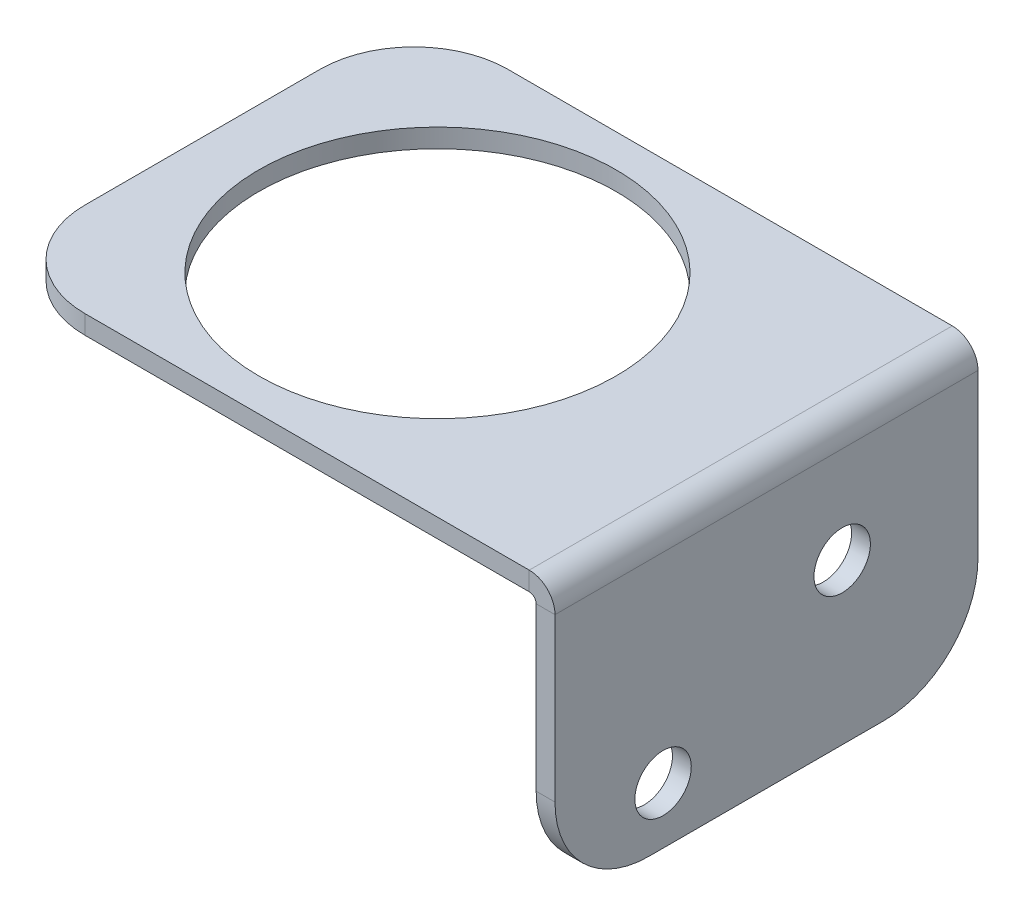
ISO-10303-21;
HEADER;
FILE_DESCRIPTION(('STEP AP214'),'2;1');
FILE_NAME('part.step','',(''),(''),'','','');
FILE_SCHEMA(('AUTOMOTIVE_DESIGN { 1 0 10303 214 1 1 1 1 }'));
ENDSEC;
DATA;
#1=APPLICATION_CONTEXT('core data for automotive mechanical design processes');
#2=APPLICATION_PROTOCOL_DEFINITION('international standard','automotive_design',2000,#1);
#3=PRODUCT_CONTEXT('',#1,'mechanical');
#4=PRODUCT('Part','Part','',(#3));
#5=PRODUCT_RELATED_PRODUCT_CATEGORY('part','',(#4));
#6=PRODUCT_DEFINITION_FORMATION('','',#4);
#7=PRODUCT_DEFINITION_CONTEXT('part definition',#1,'design');
#8=PRODUCT_DEFINITION('design','',#6,#7);
#9=PRODUCT_DEFINITION_SHAPE('','',#8);
#10=(LENGTH_UNIT() NAMED_UNIT(*) SI_UNIT(.MILLI.,.METRE.));
#11=(NAMED_UNIT(*) PLANE_ANGLE_UNIT() SI_UNIT($,.RADIAN.));
#12=(NAMED_UNIT(*) SI_UNIT($,.STERADIAN.) SOLID_ANGLE_UNIT());
#13=UNCERTAINTY_MEASURE_WITH_UNIT(LENGTH_MEASURE(1.E-05),#10,'distance_accuracy_value','');
#14=(GEOMETRIC_REPRESENTATION_CONTEXT(3) GLOBAL_UNCERTAINTY_ASSIGNED_CONTEXT((#13)) GLOBAL_UNIT_ASSIGNED_CONTEXT((#10,
#11,#12)) REPRESENTATION_CONTEXT('',''));
#15=CARTESIAN_POINT('',(0.,0.,0.));
#16=DIRECTION('',(0.,0.,1.));
#17=DIRECTION('',(1.,0.,0.));
#18=AXIS2_PLACEMENT_3D('',#15,#16,#17);
#19=CARTESIAN_POINT('',(0.,-2.7366,22.5));
#20=DIRECTION('',(0.,0.,1.));
#21=DIRECTION('',(1.,0.,0.));
#22=AXIS2_PLACEMENT_3D('',#19,#20,#21);
#23=PLANE('',#22);
#24=DIRECTION('',(-1.,0.,0.));
#25=VECTOR('',#24,1.);
#26=CARTESIAN_POINT('',(0.,-2.7366,22.5));
#27=LINE('',#26,#25);
#28=CARTESIAN_POINT('',(0.,-2.7366,22.5));
#29=VERTEX_POINT('',#28);
#30=CARTESIAN_POINT('',(-2.,-2.7366,22.5));
#31=VERTEX_POINT('',#30);
#32=EDGE_CURVE('E125',#29,#31,#27,.T.);
#33=ORIENTED_EDGE('',*,*,#32,.F.);
#34=CARTESIAN_POINT('',(-2.7366,-2.7366,22.5));
#35=DIRECTION('',(0.,0.,1.));
#36=DIRECTION('',(1.,0.,0.));
#37=AXIS2_PLACEMENT_3D('',#34,#35,#36);
#38=CIRCLE('',#37,2.7366);
#39=CARTESIAN_POINT('',(-2.7366,0.,22.5));
#40=VERTEX_POINT('',#39);
#41=EDGE_CURVE('E129',#40,#29,#38,.F.);
#42=ORIENTED_EDGE('',*,*,#41,.F.);
#43=DIRECTION('',(0.,1.,0.));
#44=VECTOR('',#43,1.);
#45=CARTESIAN_POINT('',(-2.7366,-2.,22.5));
#46=LINE('',#45,#44);
#47=CARTESIAN_POINT('',(-2.7366,-2.,22.5));
#48=VERTEX_POINT('',#47);
#49=EDGE_CURVE('E137',#48,#40,#46,.T.);
#50=ORIENTED_EDGE('',*,*,#49,.F.);
#51=CARTESIAN_POINT('',(-2.7366,-2.7366,22.5));
#52=DIRECTION('',(0.,0.,1.));
#53=DIRECTION('',(1.,0.,0.));
#54=AXIS2_PLACEMENT_3D('',#51,#52,#53);
#55=CIRCLE('',#54,0.7366);
#56=EDGE_CURVE('E131',#48,#31,#55,.F.);
#57=ORIENTED_EDGE('',*,*,#56,.T.);
#58=EDGE_LOOP('',(#33,#42,#50,#57));
#59=FACE_BOUND('',#58,.T.);
#60=ADVANCED_FACE('F34',(#59),#23,.T.);
#61=CARTESIAN_POINT('',(-2.7366,-2.,22.5));
#62=DIRECTION('',(0.,0.,1.));
#63=DIRECTION('',(1.,0.,0.));
#64=AXIS2_PLACEMENT_3D('',#61,#62,#63);
#65=PLANE('',#64);
#66=DIRECTION('',(0.,-1.,0.));
#67=VECTOR('',#66,1.);
#68=CARTESIAN_POINT('',(-2.,0.,22.5));
#69=LINE('',#68,#67);
#70=CARTESIAN_POINT('',(-2.,-20.,22.5));
#71=VERTEX_POINT('',#70);
#72=EDGE_CURVE('E158',#31,#71,#69,.T.);
#73=ORIENTED_EDGE('',*,*,#72,.T.);
#74=DIRECTION('',(-1.,0.,0.));
#75=VECTOR('',#74,1.);
#76=CARTESIAN_POINT('',(-2.7366,-20.,22.5));
#77=LINE('',#76,#75);
#78=CARTESIAN_POINT('',(0.,-20.,22.5));
#79=VERTEX_POINT('',#78);
#80=EDGE_CURVE('E157',#71,#79,#77,.F.);
#81=ORIENTED_EDGE('',*,*,#80,.T.);
#82=DIRECTION('',(0.,-1.,0.));
#83=VECTOR('',#82,1.);
#84=CARTESIAN_POINT('',(0.,0.,22.5));
#85=LINE('',#84,#83);
#86=EDGE_CURVE('E145',#29,#79,#85,.T.);
#87=ORIENTED_EDGE('',*,*,#86,.F.);
#88=ORIENTED_EDGE('',*,*,#32,.T.);
#89=EDGE_LOOP('',(#73,#81,#87,#88));
#90=FACE_BOUND('',#89,.T.);
#91=ADVANCED_FACE('F155',(#90),#65,.T.);
#92=CARTESIAN_POINT('',(-2.7366,0.,-22.5));
#93=DIRECTION('',(0.,0.,-1.));
#94=DIRECTION('',(-1.,0.,0.));
#95=AXIS2_PLACEMENT_3D('',#92,#93,#94);
#96=PLANE('',#95);
#97=DIRECTION('',(0.,-1.,0.));
#98=VECTOR('',#97,1.);
#99=CARTESIAN_POINT('',(-2.7366,0.,-22.5));
#100=LINE('',#99,#98);
#101=CARTESIAN_POINT('',(-2.7366,0.,-22.5));
#102=VERTEX_POINT('',#101);
#103=CARTESIAN_POINT('',(-2.7366,-2.,-22.5));
#104=VERTEX_POINT('',#103);
#105=EDGE_CURVE('E204',#102,#104,#100,.T.);
#106=ORIENTED_EDGE('',*,*,#105,.F.);
#107=CARTESIAN_POINT('',(-2.7366,-2.7366,-22.5));
#108=DIRECTION('',(0.,0.,1.));
#109=DIRECTION('',(1.,0.,0.));
#110=AXIS2_PLACEMENT_3D('',#107,#108,#109);
#111=CIRCLE('',#110,2.7366);
#112=CARTESIAN_POINT('',(0.,-2.7366,-22.5));
#113=VERTEX_POINT('',#112);
#114=EDGE_CURVE('E177',#102,#113,#111,.F.);
#115=ORIENTED_EDGE('',*,*,#114,.T.);
#116=DIRECTION('',(1.,0.,0.));
#117=VECTOR('',#116,1.);
#118=CARTESIAN_POINT('',(-2.,-2.7366,-22.5));
#119=LINE('',#118,#117);
#120=CARTESIAN_POINT('',(-2.,-2.7366,-22.5));
#121=VERTEX_POINT('',#120);
#122=EDGE_CURVE('E202',#121,#113,#119,.T.);
#123=ORIENTED_EDGE('',*,*,#122,.F.);
#124=CARTESIAN_POINT('',(-2.7366,-2.7366,-22.5));
#125=DIRECTION('',(0.,0.,1.));
#126=DIRECTION('',(1.,0.,0.));
#127=AXIS2_PLACEMENT_3D('',#124,#125,#126);
#128=CIRCLE('',#127,0.7366);
#129=EDGE_CURVE('E183',#104,#121,#128,.F.);
#130=ORIENTED_EDGE('',*,*,#129,.F.);
#131=EDGE_LOOP('',(#106,#115,#123,#130));
#132=FACE_BOUND('',#131,.T.);
#133=ADVANCED_FACE('F306',(#132),#96,.T.);
#134=CARTESIAN_POINT('',(-2.,-2.7366,-22.5));
#135=DIRECTION('',(0.,0.,-1.));
#136=DIRECTION('',(-1.,0.,0.));
#137=AXIS2_PLACEMENT_3D('',#134,#135,#136);
#138=PLANE('',#137);
#139=DIRECTION('',(1.,0.,0.));
#140=VECTOR('',#139,1.);
#141=CARTESIAN_POINT('',(-60.,-2.,-22.5));
#142=LINE('',#141,#140);
#143=CARTESIAN_POINT('',(-50.,-2.,-22.5));
#144=VERTEX_POINT('',#143);
#145=EDGE_CURVE('E181',#144,#104,#142,.T.);
#146=ORIENTED_EDGE('',*,*,#145,.F.);
#147=DIRECTION('',(0.,1.,0.));
#148=VECTOR('',#147,1.);
#149=CARTESIAN_POINT('',(-50.,-2.7366,-22.5));
#150=LINE('',#149,#148);
#151=CARTESIAN_POINT('',(-50.,0.,-22.5));
#152=VERTEX_POINT('',#151);
#153=EDGE_CURVE('E11',#144,#152,#150,.T.);
#154=ORIENTED_EDGE('',*,*,#153,.T.);
#155=DIRECTION('',(1.,0.,0.));
#156=VECTOR('',#155,1.);
#157=CARTESIAN_POINT('',(-60.,0.,-22.5));
#158=LINE('',#157,#156);
#159=EDGE_CURVE('E179',#152,#102,#158,.T.);
#160=ORIENTED_EDGE('',*,*,#159,.T.);
#161=ORIENTED_EDGE('',*,*,#105,.T.);
#162=EDGE_LOOP('',(#146,#154,#160,#161));
#163=FACE_BOUND('',#162,.T.);
#164=ADVANCED_FACE('F288',(#163),#138,.T.);
#165=CARTESIAN_POINT('',(-2.,0.,22.5));
#166=DIRECTION('',(1.,0.,0.));
#167=DIRECTION('',(0.,1.,0.));
#168=AXIS2_PLACEMENT_3D('',#165,#166,#167);
#169=PLANE('',#168);
#170=CARTESIAN_POINT('',(-2.,-13.,-8.05255888325763));
#171=DIRECTION('',(-1.,0.,0.));
#172=DIRECTION('',(0.,-1.,0.));
#173=AXIS2_PLACEMENT_3D('',#170,#171,#172);
#174=CIRCLE('',#173,2.99999999999999);
#175=CARTESIAN_POINT('',(-2.,-16.,-8.05255888325763));
#176=VERTEX_POINT('',#175);
#177=EDGE_CURVE('E270',#176,#176,#174,.T.);
#178=ORIENTED_EDGE('',*,*,#177,.F.);
#179=EDGE_LOOP('',(#178));
#180=FACE_BOUND('',#179,.T.);
#181=CARTESIAN_POINT('',(-2.,-24.,11.));
#182=DIRECTION('',(-1.,0.,0.));
#183=DIRECTION('',(0.,-1.,0.));
#184=AXIS2_PLACEMENT_3D('',#181,#182,#183);
#185=CIRCLE('',#184,3.);
#186=CARTESIAN_POINT('',(-2.,-27.,11.));
#187=VERTEX_POINT('',#186);
#188=EDGE_CURVE('E264',#187,#187,#185,.T.);
#189=ORIENTED_EDGE('',*,*,#188,.F.);
#190=EDGE_LOOP('',(#189));
#191=FACE_BOUND('',#190,.T.);
#192=DIRECTION('',(0.,0.,-1.));
#193=VECTOR('',#192,1.);
#194=CARTESIAN_POINT('',(-2.,-30.,22.5));
#195=LINE('',#194,#193);
#196=CARTESIAN_POINT('',(-2.,-30.,12.5));
#197=VERTEX_POINT('',#196);
#198=CARTESIAN_POINT('',(-2.,-30.,-12.5));
#199=VERTEX_POINT('',#198);
#200=EDGE_CURVE('E199',#197,#199,#195,.T.);
#201=ORIENTED_EDGE('',*,*,#200,.F.);
#202=CARTESIAN_POINT('',(-2.,-20.,12.5));
#203=DIRECTION('',(1.,0.,0.));
#204=DIRECTION('',(0.,1.,0.));
#205=AXIS2_PLACEMENT_3D('',#202,#203,#204);
#206=CIRCLE('',#205,10.);
#207=EDGE_CURVE('E218',#197,#71,#206,.F.);
#208=ORIENTED_EDGE('',*,*,#207,.T.);
#209=ORIENTED_EDGE('',*,*,#72,.F.);
#210=DIRECTION('',(0.,0.,-1.));
#211=VECTOR('',#210,1.);
#212=CARTESIAN_POINT('',(-2.,-2.7366,22.5));
#213=LINE('',#212,#211);
#214=EDGE_CURVE('E171',#31,#121,#213,.T.);
#215=ORIENTED_EDGE('',*,*,#214,.T.);
#216=DIRECTION('',(0.,-1.,0.));
#217=VECTOR('',#216,1.);
#218=CARTESIAN_POINT('',(-2.,0.,-22.5));
#219=LINE('',#218,#217);
#220=CARTESIAN_POINT('',(-2.,-20.,-22.5));
#221=VERTEX_POINT('',#220);
#222=EDGE_CURVE('E172',#121,#221,#219,.T.);
#223=ORIENTED_EDGE('',*,*,#222,.T.);
#224=CARTESIAN_POINT('',(-2.,-20.,-12.5));
#225=DIRECTION('',(1.,0.,0.));
#226=DIRECTION('',(0.,1.,0.));
#227=AXIS2_PLACEMENT_3D('',#224,#225,#226);
#228=CIRCLE('',#227,10.);
#229=EDGE_CURVE('E216',#221,#199,#228,.F.);
#230=ORIENTED_EDGE('',*,*,#229,.T.);
#231=EDGE_LOOP('',(#201,#208,#209,#215,#223,#230));
#232=FACE_BOUND('',#231,.T.);
#233=ADVANCED_FACE('F259',(#180,#191,#232),#169,.F.);
#234=CARTESIAN_POINT('',(0.,-30.,22.5));
#235=DIRECTION('',(0.,-1.,0.));
#236=DIRECTION('',(0.,0.,-1.));
#237=AXIS2_PLACEMENT_3D('',#234,#235,#236);
#238=PLANE('',#237);
#239=DIRECTION('',(0.,0.,-1.));
#240=VECTOR('',#239,1.);
#241=CARTESIAN_POINT('',(0.,-30.,22.5));
#242=LINE('',#241,#240);
#243=CARTESIAN_POINT('',(0.,-30.,12.5));
#244=VERTEX_POINT('',#243);
#245=CARTESIAN_POINT('',(0.,-30.,-12.5));
#246=VERTEX_POINT('',#245);
#247=EDGE_CURVE('E152',#244,#246,#242,.T.);
#248=ORIENTED_EDGE('',*,*,#247,.F.);
#249=DIRECTION('',(-1.,0.,0.));
#250=VECTOR('',#249,1.);
#251=CARTESIAN_POINT('',(0.,-30.,12.5));
#252=LINE('',#251,#250);
#253=EDGE_CURVE('E213',#244,#197,#252,.T.);
#254=ORIENTED_EDGE('',*,*,#253,.T.);
#255=ORIENTED_EDGE('',*,*,#200,.T.);
#256=DIRECTION('',(-1.,0.,0.));
#257=VECTOR('',#256,1.);
#258=CARTESIAN_POINT('',(0.,-30.,-12.5));
#259=LINE('',#258,#257);
#260=EDGE_CURVE('E136',#199,#246,#259,.F.);
#261=ORIENTED_EDGE('',*,*,#260,.T.);
#262=EDGE_LOOP('',(#248,#254,#255,#261));
#263=FACE_BOUND('',#262,.T.);
#264=ADVANCED_FACE('F287',(#263),#238,.T.);
#265=CARTESIAN_POINT('',(0.,0.,22.5));
#266=DIRECTION('',(1.,0.,0.));
#267=DIRECTION('',(0.,1.,0.));
#268=AXIS2_PLACEMENT_3D('',#265,#266,#267);
#269=PLANE('',#268);
#270=CARTESIAN_POINT('',(0.,-13.,-8.05255888325763));
#271=DIRECTION('',(-1.,0.,0.));
#272=DIRECTION('',(0.,-1.,0.));
#273=AXIS2_PLACEMENT_3D('',#270,#271,#272);
#274=CIRCLE('',#273,2.99999999999999);
#275=CARTESIAN_POINT('',(0.,-16.,-8.05255888325763));
#276=VERTEX_POINT('',#275);
#277=EDGE_CURVE('E267',#276,#276,#274,.T.);
#278=ORIENTED_EDGE('',*,*,#277,.T.);
#279=EDGE_LOOP('',(#278));
#280=FACE_BOUND('',#279,.T.);
#281=CARTESIAN_POINT('',(0.,-24.,11.));
#282=DIRECTION('',(-1.,0.,0.));
#283=DIRECTION('',(0.,-1.,0.));
#284=AXIS2_PLACEMENT_3D('',#281,#282,#283);
#285=CIRCLE('',#284,3.);
#286=CARTESIAN_POINT('',(0.,-27.,11.));
#287=VERTEX_POINT('',#286);
#288=EDGE_CURVE('E263',#287,#287,#285,.T.);
#289=ORIENTED_EDGE('',*,*,#288,.T.);
#290=EDGE_LOOP('',(#289));
#291=FACE_BOUND('',#290,.T.);
#292=ORIENTED_EDGE('',*,*,#86,.T.);
#293=CARTESIAN_POINT('',(0.,-20.,12.5));
#294=DIRECTION('',(1.,0.,0.));
#295=DIRECTION('',(0.,1.,0.));
#296=AXIS2_PLACEMENT_3D('',#293,#294,#295);
#297=CIRCLE('',#296,10.);
#298=EDGE_CURVE('E223',#79,#244,#297,.T.);
#299=ORIENTED_EDGE('',*,*,#298,.T.);
#300=ORIENTED_EDGE('',*,*,#247,.T.);
#301=CARTESIAN_POINT('',(0.,-20.,-12.5));
#302=DIRECTION('',(1.,0.,0.));
#303=DIRECTION('',(0.,1.,0.));
#304=AXIS2_PLACEMENT_3D('',#301,#302,#303);
#305=CIRCLE('',#304,10.);
#306=CARTESIAN_POINT('',(0.,-20.,-22.5));
#307=VERTEX_POINT('',#306);
#308=EDGE_CURVE('E221',#246,#307,#305,.T.);
#309=ORIENTED_EDGE('',*,*,#308,.T.);
#310=DIRECTION('',(0.,-1.,0.));
#311=VECTOR('',#310,1.);
#312=CARTESIAN_POINT('',(0.,0.,-22.5));
#313=LINE('',#312,#311);
#314=EDGE_CURVE('E148',#113,#307,#313,.T.);
#315=ORIENTED_EDGE('',*,*,#314,.F.);
#316=DIRECTION('',(0.,0.,-1.));
#317=VECTOR('',#316,1.);
#318=CARTESIAN_POINT('',(0.,-2.7366,22.5));
#319=LINE('',#318,#317);
#320=EDGE_CURVE('E143',#29,#113,#319,.T.);
#321=ORIENTED_EDGE('',*,*,#320,.F.);
#322=EDGE_LOOP('',(#292,#299,#300,#309,#315,#321));
#323=FACE_BOUND('',#322,.T.);
#324=ADVANCED_FACE('F144',(#280,#291,#323),#269,.T.);
#325=CARTESIAN_POINT('',(-2.7366,-2.7366,22.5));
#326=DIRECTION('',(0.,0.,-1.));
#327=DIRECTION('',(-1.,0.,0.));
#328=AXIS2_PLACEMENT_3D('',#325,#326,#327);
#329=CYLINDRICAL_SURFACE('',#328,2.7366);
#330=ORIENTED_EDGE('',*,*,#114,.F.);
#331=DIRECTION('',(0.,0.,-1.));
#332=VECTOR('',#331,1.);
#333=CARTESIAN_POINT('',(-2.7366,0.,22.5));
#334=LINE('',#333,#332);
#335=EDGE_CURVE('E153',#40,#102,#334,.T.);
#336=ORIENTED_EDGE('',*,*,#335,.F.);
#337=ORIENTED_EDGE('',*,*,#41,.T.);
#338=ORIENTED_EDGE('',*,*,#320,.T.);
#339=EDGE_LOOP('',(#330,#336,#337,#338));
#340=FACE_BOUND('',#339,.T.);
#341=ADVANCED_FACE('F161',(#340),#329,.T.);
#342=CARTESIAN_POINT('',(-60.,0.,22.5));
#343=DIRECTION('',(0.,1.,0.));
#344=DIRECTION('',(0.,0.,1.));
#345=AXIS2_PLACEMENT_3D('',#342,#343,#344);
#346=PLANE('',#345);
#347=CARTESIAN_POINT('',(-35.,0.,0.));
#348=DIRECTION('',(0.,1.,0.));
#349=DIRECTION('',(0.,0.,1.));
#350=AXIS2_PLACEMENT_3D('',#347,#348,#349);
#351=CIRCLE('',#350,19.);
#352=CARTESIAN_POINT('',(-35.,0.,19.));
#353=VERTEX_POINT('',#352);
#354=EDGE_CURVE('E211',#353,#353,#351,.T.);
#355=ORIENTED_EDGE('',*,*,#354,.F.);
#356=EDGE_LOOP('',(#355));
#357=FACE_BOUND('',#356,.T.);
#358=DIRECTION('',(0.,0.,-1.));
#359=VECTOR('',#358,1.);
#360=CARTESIAN_POINT('',(-60.,0.,22.5));
#361=LINE('',#360,#359);
#362=CARTESIAN_POINT('',(-60.,0.,12.5));
#363=VERTEX_POINT('',#362);
#364=CARTESIAN_POINT('',(-60.,0.,-12.5));
#365=VERTEX_POINT('',#364);
#366=EDGE_CURVE('E193',#363,#365,#361,.T.);
#367=ORIENTED_EDGE('',*,*,#366,.F.);
#368=CARTESIAN_POINT('',(-50.,0.,12.5));
#369=DIRECTION('',(0.,1.,0.));
#370=DIRECTION('',(0.,0.,1.));
#371=AXIS2_PLACEMENT_3D('',#368,#369,#370);
#372=CIRCLE('',#371,10.);
#373=CARTESIAN_POINT('',(-50.,0.,22.5));
#374=VERTEX_POINT('',#373);
#375=EDGE_CURVE('E235',#363,#374,#372,.T.);
#376=ORIENTED_EDGE('',*,*,#375,.T.);
#377=DIRECTION('',(1.,0.,0.));
#378=VECTOR('',#377,1.);
#379=CARTESIAN_POINT('',(-60.,0.,22.5));
#380=LINE('',#379,#378);
#381=EDGE_CURVE('E163',#374,#40,#380,.T.);
#382=ORIENTED_EDGE('',*,*,#381,.T.);
#383=ORIENTED_EDGE('',*,*,#335,.T.);
#384=ORIENTED_EDGE('',*,*,#159,.F.);
#385=CARTESIAN_POINT('',(-50.,0.,-12.5));
#386=DIRECTION('',(0.,1.,0.));
#387=DIRECTION('',(0.,0.,1.));
#388=AXIS2_PLACEMENT_3D('',#385,#386,#387);
#389=CIRCLE('',#388,10.);
#390=EDGE_CURVE('E233',#152,#365,#389,.T.);
#391=ORIENTED_EDGE('',*,*,#390,.T.);
#392=EDGE_LOOP('',(#367,#376,#382,#383,#384,#391));
#393=FACE_BOUND('',#392,.T.);
#394=ADVANCED_FACE('F250',(#357,#393),#346,.T.);
#395=CARTESIAN_POINT('',(-60.,-2.,22.5));
#396=DIRECTION('',(-1.,0.,0.));
#397=DIRECTION('',(0.,0.,1.));
#398=AXIS2_PLACEMENT_3D('',#395,#396,#397);
#399=PLANE('',#398);
#400=DIRECTION('',(0.,0.,-1.));
#401=VECTOR('',#400,1.);
#402=CARTESIAN_POINT('',(-60.,-2.,22.5));
#403=LINE('',#402,#401);
#404=CARTESIAN_POINT('',(-60.,-2.,12.5));
#405=VERTEX_POINT('',#404);
#406=CARTESIAN_POINT('',(-60.,-2.,-12.5));
#407=VERTEX_POINT('',#406);
#408=EDGE_CURVE('E191',#405,#407,#403,.T.);
#409=ORIENTED_EDGE('',*,*,#408,.F.);
#410=DIRECTION('',(0.,1.,0.));
#411=VECTOR('',#410,1.);
#412=CARTESIAN_POINT('',(-60.,-2.,12.5));
#413=LINE('',#412,#411);
#414=EDGE_CURVE('E230',#405,#363,#413,.T.);
#415=ORIENTED_EDGE('',*,*,#414,.T.);
#416=ORIENTED_EDGE('',*,*,#366,.T.);
#417=DIRECTION('',(0.,1.,0.));
#418=VECTOR('',#417,1.);
#419=CARTESIAN_POINT('',(-60.,-2.,-12.5));
#420=LINE('',#419,#418);
#421=EDGE_CURVE('E228',#365,#407,#420,.F.);
#422=ORIENTED_EDGE('',*,*,#421,.T.);
#423=EDGE_LOOP('',(#409,#415,#416,#422));
#424=FACE_BOUND('',#423,.T.);
#425=ADVANCED_FACE('F245',(#424),#399,.T.);
#426=CARTESIAN_POINT('',(-60.,-2.,22.5));
#427=DIRECTION('',(0.,1.,0.));
#428=DIRECTION('',(0.,0.,1.));
#429=AXIS2_PLACEMENT_3D('',#426,#427,#428);
#430=PLANE('',#429);
#431=CARTESIAN_POINT('',(-35.,-2.,0.));
#432=DIRECTION('',(0.,1.,0.));
#433=DIRECTION('',(0.,0.,1.));
#434=AXIS2_PLACEMENT_3D('',#431,#432,#433);
#435=CIRCLE('',#434,19.);
#436=CARTESIAN_POINT('',(-35.,-2.,19.));
#437=VERTEX_POINT('',#436);
#438=EDGE_CURVE('E175',#437,#437,#435,.T.);
#439=ORIENTED_EDGE('',*,*,#438,.T.);
#440=EDGE_LOOP('',(#439));
#441=FACE_BOUND('',#440,.T.);
#442=DIRECTION('',(1.,0.,0.));
#443=VECTOR('',#442,1.);
#444=CARTESIAN_POINT('',(-60.,-2.,22.5));
#445=LINE('',#444,#443);
#446=CARTESIAN_POINT('',(-50.,-2.,22.5));
#447=VERTEX_POINT('',#446);
#448=EDGE_CURVE('E165',#447,#48,#445,.T.);
#449=ORIENTED_EDGE('',*,*,#448,.F.);
#450=CARTESIAN_POINT('',(-50.,-2.,12.5));
#451=DIRECTION('',(0.,1.,0.));
#452=DIRECTION('',(0.,0.,1.));
#453=AXIS2_PLACEMENT_3D('',#450,#451,#452);
#454=CIRCLE('',#453,10.);
#455=EDGE_CURVE('E42',#447,#405,#454,.F.);
#456=ORIENTED_EDGE('',*,*,#455,.T.);
#457=ORIENTED_EDGE('',*,*,#408,.T.);
#458=CARTESIAN_POINT('',(-50.,-2.,-12.5));
#459=DIRECTION('',(0.,1.,0.));
#460=DIRECTION('',(0.,0.,1.));
#461=AXIS2_PLACEMENT_3D('',#458,#459,#460);
#462=CIRCLE('',#461,10.);
#463=EDGE_CURVE('E49',#407,#144,#462,.F.);
#464=ORIENTED_EDGE('',*,*,#463,.T.);
#465=ORIENTED_EDGE('',*,*,#145,.T.);
#466=DIRECTION('',(0.,0.,-1.));
#467=VECTOR('',#466,1.);
#468=CARTESIAN_POINT('',(-2.7366,-2.,22.5));
#469=LINE('',#468,#467);
#470=EDGE_CURVE('E188',#48,#104,#469,.T.);
#471=ORIENTED_EDGE('',*,*,#470,.F.);
#472=EDGE_LOOP('',(#449,#456,#457,#464,#465,#471));
#473=FACE_BOUND('',#472,.T.);
#474=ADVANCED_FACE('F240',(#441,#473),#430,.F.);
#475=CARTESIAN_POINT('',(-2.7366,-2.7366,22.5));
#476=DIRECTION('',(0.,0.,-1.));
#477=DIRECTION('',(-1.,0.,0.));
#478=AXIS2_PLACEMENT_3D('',#475,#476,#477);
#479=CYLINDRICAL_SURFACE('',#478,0.7366);
#480=ORIENTED_EDGE('',*,*,#129,.T.);
#481=ORIENTED_EDGE('',*,*,#214,.F.);
#482=ORIENTED_EDGE('',*,*,#56,.F.);
#483=ORIENTED_EDGE('',*,*,#470,.T.);
#484=EDGE_LOOP('',(#480,#481,#482,#483));
#485=FACE_BOUND('',#484,.T.);
#486=ADVANCED_FACE('F254',(#485),#479,.F.);
#487=CARTESIAN_POINT('',(-2.7366,-2.7366,22.5));
#488=DIRECTION('',(0.,0.,1.));
#489=DIRECTION('',(1.,0.,0.));
#490=AXIS2_PLACEMENT_3D('',#487,#488,#489);
#491=PLANE('',#490);
#492=ORIENTED_EDGE('',*,*,#381,.F.);
#493=DIRECTION('',(0.,1.,0.));
#494=VECTOR('',#493,1.);
#495=CARTESIAN_POINT('',(-50.,-2.7366,22.5));
#496=LINE('',#495,#494);
#497=EDGE_CURVE('E57',#374,#447,#496,.F.);
#498=ORIENTED_EDGE('',*,*,#497,.T.);
#499=ORIENTED_EDGE('',*,*,#448,.T.);
#500=ORIENTED_EDGE('',*,*,#49,.T.);
#501=EDGE_LOOP('',(#492,#498,#499,#500));
#502=FACE_BOUND('',#501,.T.);
#503=ADVANCED_FACE('F251',(#502),#491,.T.);
#504=CARTESIAN_POINT('',(-2.7366,-2.7366,-22.5));
#505=DIRECTION('',(0.,0.,1.));
#506=DIRECTION('',(1.,0.,0.));
#507=AXIS2_PLACEMENT_3D('',#504,#505,#506);
#508=PLANE('',#507);
#509=ORIENTED_EDGE('',*,*,#314,.T.);
#510=DIRECTION('',(-1.,0.,0.));
#511=VECTOR('',#510,1.);
#512=CARTESIAN_POINT('',(-2.,-20.,-22.5));
#513=LINE('',#512,#511);
#514=EDGE_CURVE('E225',#307,#221,#513,.T.);
#515=ORIENTED_EDGE('',*,*,#514,.T.);
#516=ORIENTED_EDGE('',*,*,#222,.F.);
#517=ORIENTED_EDGE('',*,*,#122,.T.);
#518=EDGE_LOOP('',(#509,#515,#516,#517));
#519=FACE_BOUND('',#518,.T.);
#520=ADVANCED_FACE('F401',(#519),#508,.F.);
#521=CARTESIAN_POINT('',(-35.,-30.,0.));
#522=DIRECTION('',(0.,1.,0.));
#523=DIRECTION('',(0.,0.,1.));
#524=AXIS2_PLACEMENT_3D('',#521,#522,#523);
#525=CYLINDRICAL_SURFACE('',#524,19.);
#526=ORIENTED_EDGE('',*,*,#354,.T.);
#527=EDGE_LOOP('',(#526));
#528=FACE_BOUND('',#527,.T.);
#529=ORIENTED_EDGE('',*,*,#438,.F.);
#530=EDGE_LOOP('',(#529));
#531=FACE_BOUND('',#530,.T.);
#532=ADVANCED_FACE('F314',(#528,#531),#525,.F.);
#533=CARTESIAN_POINT('',(0.,-20.,12.5));
#534=DIRECTION('',(-1.,0.,0.));
#535=DIRECTION('',(0.,0.,1.));
#536=AXIS2_PLACEMENT_3D('',#533,#534,#535);
#537=CYLINDRICAL_SURFACE('',#536,10.);
#538=ORIENTED_EDGE('',*,*,#298,.F.);
#539=ORIENTED_EDGE('',*,*,#80,.F.);
#540=ORIENTED_EDGE('',*,*,#207,.F.);
#541=ORIENTED_EDGE('',*,*,#253,.F.);
#542=EDGE_LOOP('',(#538,#539,#540,#541));
#543=FACE_BOUND('',#542,.T.);
#544=ADVANCED_FACE('F310',(#543),#537,.T.);
#545=CARTESIAN_POINT('',(-2.7366,-20.,-12.5));
#546=DIRECTION('',(1.,0.,0.));
#547=DIRECTION('',(0.,0.,-1.));
#548=AXIS2_PLACEMENT_3D('',#545,#546,#547);
#549=CYLINDRICAL_SURFACE('',#548,10.);
#550=ORIENTED_EDGE('',*,*,#308,.F.);
#551=ORIENTED_EDGE('',*,*,#260,.F.);
#552=ORIENTED_EDGE('',*,*,#229,.F.);
#553=ORIENTED_EDGE('',*,*,#514,.F.);
#554=EDGE_LOOP('',(#550,#551,#552,#553));
#555=FACE_BOUND('',#554,.T.);
#556=ADVANCED_FACE('F313',(#555),#549,.T.);
#557=CARTESIAN_POINT('',(-50.,-2.,12.5));
#558=DIRECTION('',(0.,1.,0.));
#559=DIRECTION('',(0.,0.,1.));
#560=AXIS2_PLACEMENT_3D('',#557,#558,#559);
#561=CYLINDRICAL_SURFACE('',#560,10.);
#562=ORIENTED_EDGE('',*,*,#455,.F.);
#563=ORIENTED_EDGE('',*,*,#497,.F.);
#564=ORIENTED_EDGE('',*,*,#375,.F.);
#565=ORIENTED_EDGE('',*,*,#414,.F.);
#566=EDGE_LOOP('',(#562,#563,#564,#565));
#567=FACE_BOUND('',#566,.T.);
#568=ADVANCED_FACE('F248',(#567),#561,.T.);
#569=CARTESIAN_POINT('',(-50.,-2.7366,-12.5));
#570=DIRECTION('',(0.,1.,0.));
#571=DIRECTION('',(0.,0.,1.));
#572=AXIS2_PLACEMENT_3D('',#569,#570,#571);
#573=CYLINDRICAL_SURFACE('',#572,10.);
#574=ORIENTED_EDGE('',*,*,#463,.F.);
#575=ORIENTED_EDGE('',*,*,#421,.F.);
#576=ORIENTED_EDGE('',*,*,#390,.F.);
#577=ORIENTED_EDGE('',*,*,#153,.F.);
#578=EDGE_LOOP('',(#574,#575,#576,#577));
#579=FACE_BOUND('',#578,.T.);
#580=ADVANCED_FACE('F36',(#579),#573,.T.);
#581=CARTESIAN_POINT('',(0.,-24.,11.));
#582=DIRECTION('',(-1.,0.,0.));
#583=DIRECTION('',(0.,-1.,0.));
#584=AXIS2_PLACEMENT_3D('',#581,#582,#583);
#585=CYLINDRICAL_SURFACE('',#584,3.);
#586=ORIENTED_EDGE('',*,*,#288,.F.);
#587=EDGE_LOOP('',(#586));
#588=FACE_BOUND('',#587,.T.);
#589=ORIENTED_EDGE('',*,*,#188,.T.);
#590=EDGE_LOOP('',(#589));
#591=FACE_BOUND('',#590,.T.);
#592=ADVANCED_FACE('F281',(#588,#591),#585,.F.);
#593=CARTESIAN_POINT('',(0.,-13.,-8.05255888325763));
#594=DIRECTION('',(-1.,0.,0.));
#595=DIRECTION('',(0.,-1.,0.));
#596=AXIS2_PLACEMENT_3D('',#593,#594,#595);
#597=CYLINDRICAL_SURFACE('',#596,2.99999999999999);
#598=ORIENTED_EDGE('',*,*,#277,.F.);
#599=EDGE_LOOP('',(#598));
#600=FACE_BOUND('',#599,.T.);
#601=ORIENTED_EDGE('',*,*,#177,.T.);
#602=EDGE_LOOP('',(#601));
#603=FACE_BOUND('',#602,.T.);
#604=ADVANCED_FACE('F278',(#600,#603),#597,.F.);
#605=CLOSED_SHELL('',(#60,#91,#133,#164,#233,#264,#324,#341,#394,#425,#474,#486,#503,#520,#532,
#544,#556,#568,#580,#592,#604));
#606=MANIFOLD_SOLID_BREP('B2',#605);
#607=ADVANCED_BREP_SHAPE_REPRESENTATION('',(#18,#606),#14);
#608=SHAPE_DEFINITION_REPRESENTATION(#9,#607);
ENDSEC;
END-ISO-10303-21;
